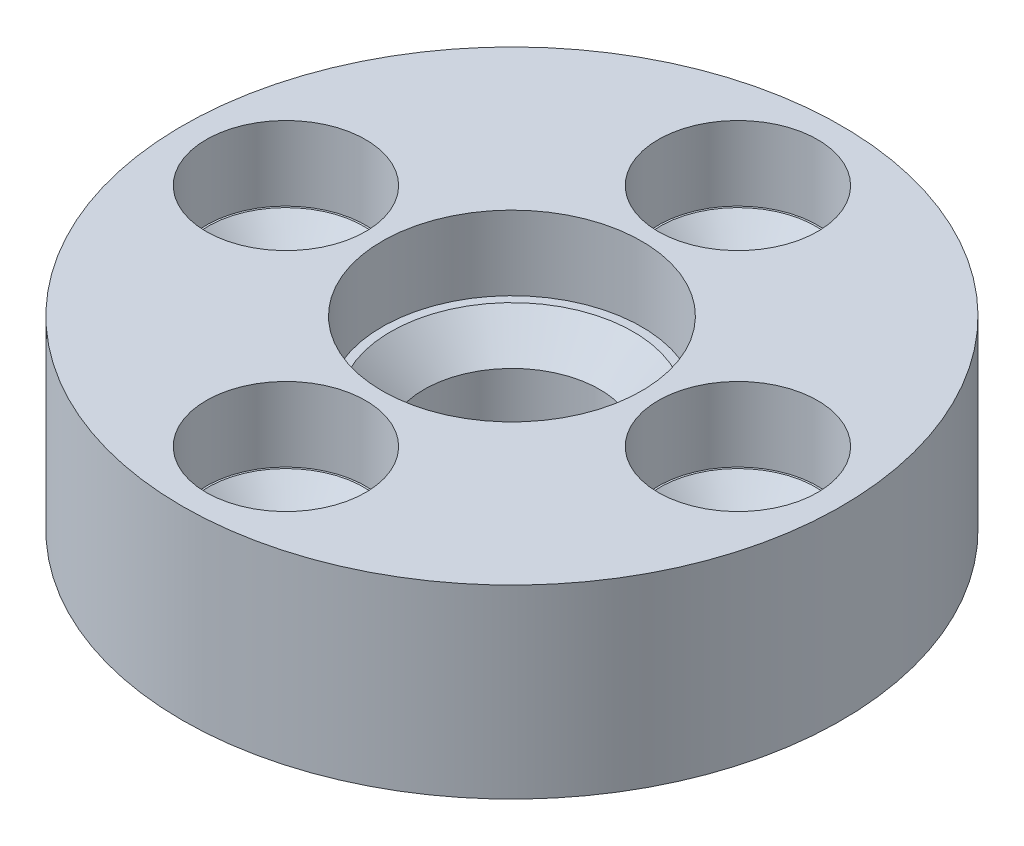
ISO-10303-21;
HEADER;
FILE_DESCRIPTION(('STEP AP214'),'2;1');
FILE_NAME('part.step','',(''),(''),'','','');
FILE_SCHEMA(('AUTOMOTIVE_DESIGN { 1 0 10303 214 1 1 1 1 }'));
ENDSEC;
DATA;
#1=APPLICATION_CONTEXT('core data for automotive mechanical design processes');
#2=APPLICATION_PROTOCOL_DEFINITION('international standard','automotive_design',2000,#1);
#3=PRODUCT_CONTEXT('',#1,'mechanical');
#4=PRODUCT('Part','Part','',(#3));
#5=PRODUCT_RELATED_PRODUCT_CATEGORY('part','',(#4));
#6=PRODUCT_DEFINITION_FORMATION('','',#4);
#7=PRODUCT_DEFINITION_CONTEXT('part definition',#1,'design');
#8=PRODUCT_DEFINITION('design','',#6,#7);
#9=PRODUCT_DEFINITION_SHAPE('','',#8);
#10=(LENGTH_UNIT() NAMED_UNIT(*) SI_UNIT(.MILLI.,.METRE.));
#11=(NAMED_UNIT(*) PLANE_ANGLE_UNIT() SI_UNIT($,.RADIAN.));
#12=(NAMED_UNIT(*) SI_UNIT($,.STERADIAN.) SOLID_ANGLE_UNIT());
#13=UNCERTAINTY_MEASURE_WITH_UNIT(LENGTH_MEASURE(1.E-05),#10,'distance_accuracy_value','');
#14=(GEOMETRIC_REPRESENTATION_CONTEXT(3) GLOBAL_UNCERTAINTY_ASSIGNED_CONTEXT((#13)) GLOBAL_UNIT_ASSIGNED_CONTEXT((#10,
#11,#12)) REPRESENTATION_CONTEXT('',''));
#15=CARTESIAN_POINT('',(0.,0.,0.));
#16=DIRECTION('',(0.,0.,1.));
#17=DIRECTION('',(1.,0.,0.));
#18=AXIS2_PLACEMENT_3D('',#15,#16,#17);
#19=CARTESIAN_POINT('',(6.096,5.,0.));
#20=DIRECTION('',(0.,-1.,0.));
#21=DIRECTION('',(0.,0.,-1.));
#22=AXIS2_PLACEMENT_3D('',#19,#20,#21);
#23=CYLINDRICAL_SURFACE('',#22,1.2);
#24=CARTESIAN_POINT('',(6.096,2.1,0.));
#25=DIRECTION('',(0.,1.,0.));
#26=DIRECTION('',(0.,0.,1.));
#27=AXIS2_PLACEMENT_3D('',#24,#25,#26);
#28=CIRCLE('',#27,1.2);
#29=CARTESIAN_POINT('',(6.096,2.1,1.2));
#30=VERTEX_POINT('',#29);
#31=EDGE_CURVE('E67',#30,#30,#28,.T.);
#32=ORIENTED_EDGE('',*,*,#31,.T.);
#33=EDGE_LOOP('',(#32));
#34=FACE_BOUND('',#33,.T.);
#35=CARTESIAN_POINT('',(6.096,0.,0.));
#36=DIRECTION('',(0.,1.,0.));
#37=DIRECTION('',(0.,0.,1.));
#38=AXIS2_PLACEMENT_3D('',#35,#36,#37);
#39=CIRCLE('',#38,1.2);
#40=CARTESIAN_POINT('',(6.096,0.,1.2));
#41=VERTEX_POINT('',#40);
#42=EDGE_CURVE('E80',#41,#41,#39,.T.);
#43=ORIENTED_EDGE('',*,*,#42,.F.);
#44=EDGE_LOOP('',(#43));
#45=FACE_BOUND('',#44,.T.);
#46=ADVANCED_FACE('F38',(#34,#45),#23,.F.);
#47=CARTESIAN_POINT('',(0.,5.,-6.096));
#48=DIRECTION('',(0.,-1.,0.));
#49=DIRECTION('',(0.,0.,-1.));
#50=AXIS2_PLACEMENT_3D('',#47,#48,#49);
#51=CYLINDRICAL_SURFACE('',#50,1.2);
#52=CARTESIAN_POINT('',(0.,2.1,-6.096));
#53=DIRECTION('',(0.,1.,0.));
#54=DIRECTION('',(0.,0.,1.));
#55=AXIS2_PLACEMENT_3D('',#52,#53,#54);
#56=CIRCLE('',#55,1.2);
#57=CARTESIAN_POINT('',(0.,2.1,-4.896));
#58=VERTEX_POINT('',#57);
#59=EDGE_CURVE('E45',#58,#58,#56,.T.);
#60=ORIENTED_EDGE('',*,*,#59,.T.);
#61=EDGE_LOOP('',(#60));
#62=FACE_BOUND('',#61,.T.);
#63=CARTESIAN_POINT('',(0.,0.,-6.096));
#64=DIRECTION('',(0.,1.,0.));
#65=DIRECTION('',(0.,0.,1.));
#66=AXIS2_PLACEMENT_3D('',#63,#64,#65);
#67=CIRCLE('',#66,1.2);
#68=CARTESIAN_POINT('',(0.,0.,-4.896));
#69=VERTEX_POINT('',#68);
#70=EDGE_CURVE('E83',#69,#69,#67,.T.);
#71=ORIENTED_EDGE('',*,*,#70,.F.);
#72=EDGE_LOOP('',(#71));
#73=FACE_BOUND('',#72,.T.);
#74=ADVANCED_FACE('F171',(#62,#73),#51,.F.);
#75=CARTESIAN_POINT('',(-6.096,5.,0.));
#76=DIRECTION('',(0.,-1.,0.));
#77=DIRECTION('',(0.,0.,-1.));
#78=AXIS2_PLACEMENT_3D('',#75,#76,#77);
#79=CYLINDRICAL_SURFACE('',#78,1.2);
#80=CARTESIAN_POINT('',(-6.096,2.1,0.));
#81=DIRECTION('',(0.,1.,0.));
#82=DIRECTION('',(0.,0.,1.));
#83=AXIS2_PLACEMENT_3D('',#80,#81,#82);
#84=CIRCLE('',#83,1.2);
#85=CARTESIAN_POINT('',(-6.096,2.1,1.2));
#86=VERTEX_POINT('',#85);
#87=EDGE_CURVE('E53',#86,#86,#84,.T.);
#88=ORIENTED_EDGE('',*,*,#87,.T.);
#89=EDGE_LOOP('',(#88));
#90=FACE_BOUND('',#89,.T.);
#91=CARTESIAN_POINT('',(-6.096,0.,0.));
#92=DIRECTION('',(0.,1.,0.));
#93=DIRECTION('',(0.,0.,1.));
#94=AXIS2_PLACEMENT_3D('',#91,#92,#93);
#95=CIRCLE('',#94,1.2);
#96=CARTESIAN_POINT('',(-6.096,0.,1.2));
#97=VERTEX_POINT('',#96);
#98=EDGE_CURVE('E86',#97,#97,#95,.T.);
#99=ORIENTED_EDGE('',*,*,#98,.F.);
#100=EDGE_LOOP('',(#99));
#101=FACE_BOUND('',#100,.T.);
#102=ADVANCED_FACE('F177',(#90,#101),#79,.F.);
#103=CARTESIAN_POINT('',(0.,5.,6.096));
#104=DIRECTION('',(0.,-1.,0.));
#105=DIRECTION('',(0.,0.,-1.));
#106=AXIS2_PLACEMENT_3D('',#103,#104,#105);
#107=CYLINDRICAL_SURFACE('',#106,1.2);
#108=CARTESIAN_POINT('',(0.,2.1,6.096));
#109=DIRECTION('',(0.,1.,0.));
#110=DIRECTION('',(0.,0.,1.));
#111=AXIS2_PLACEMENT_3D('',#108,#109,#110);
#112=CIRCLE('',#111,1.2);
#113=CARTESIAN_POINT('',(0.,2.1,7.296));
#114=VERTEX_POINT('',#113);
#115=EDGE_CURVE('E73',#114,#114,#112,.T.);
#116=ORIENTED_EDGE('',*,*,#115,.T.);
#117=EDGE_LOOP('',(#116));
#118=FACE_BOUND('',#117,.T.);
#119=CARTESIAN_POINT('',(0.,0.,6.096));
#120=DIRECTION('',(0.,1.,0.));
#121=DIRECTION('',(0.,0.,1.));
#122=AXIS2_PLACEMENT_3D('',#119,#120,#121);
#123=CIRCLE('',#122,1.2);
#124=CARTESIAN_POINT('',(0.,0.,7.296));
#125=VERTEX_POINT('',#124);
#126=EDGE_CURVE('E89',#125,#125,#123,.T.);
#127=ORIENTED_EDGE('',*,*,#126,.F.);
#128=EDGE_LOOP('',(#127));
#129=FACE_BOUND('',#128,.T.);
#130=ADVANCED_FACE('F183',(#118,#129),#107,.F.);
#131=CARTESIAN_POINT('',(0.,5.,0.));
#132=DIRECTION('',(0.,-1.,0.));
#133=DIRECTION('',(0.,0.,-1.));
#134=AXIS2_PLACEMENT_3D('',#131,#132,#133);
#135=CYLINDRICAL_SURFACE('',#134,2.37125);
#136=CARTESIAN_POINT('',(0.,2.1,0.));
#137=DIRECTION('',(0.,1.,0.));
#138=DIRECTION('',(0.,0.,1.));
#139=AXIS2_PLACEMENT_3D('',#136,#137,#138);
#140=CIRCLE('',#139,2.37125);
#141=CARTESIAN_POINT('',(0.,2.1,2.37125));
#142=VERTEX_POINT('',#141);
#143=EDGE_CURVE('E61',#142,#142,#140,.T.);
#144=ORIENTED_EDGE('',*,*,#143,.T.);
#145=EDGE_LOOP('',(#144));
#146=FACE_BOUND('',#145,.T.);
#147=CARTESIAN_POINT('',(0.,0.,0.));
#148=DIRECTION('',(0.,1.,0.));
#149=DIRECTION('',(0.,0.,1.));
#150=AXIS2_PLACEMENT_3D('',#147,#148,#149);
#151=CIRCLE('',#150,2.37125);
#152=CARTESIAN_POINT('',(0.,0.,2.37125));
#153=VERTEX_POINT('',#152);
#154=EDGE_CURVE('E92',#153,#153,#151,.T.);
#155=ORIENTED_EDGE('',*,*,#154,.F.);
#156=EDGE_LOOP('',(#155));
#157=FACE_BOUND('',#156,.T.);
#158=ADVANCED_FACE('F155',(#146,#157),#135,.F.);
#159=CARTESIAN_POINT('',(0.,5.,0.));
#160=DIRECTION('',(0.,-1.,0.));
#161=DIRECTION('',(0.,0.,-1.));
#162=AXIS2_PLACEMENT_3D('',#159,#160,#161);
#163=CYLINDRICAL_SURFACE('',#162,8.89);
#164=CARTESIAN_POINT('',(0.,5.,0.));
#165=DIRECTION('',(0.,1.,0.));
#166=DIRECTION('',(0.,0.,1.));
#167=AXIS2_PLACEMENT_3D('',#164,#165,#166);
#168=CIRCLE('',#167,8.89);
#169=CARTESIAN_POINT('',(0.,5.,8.89));
#170=VERTEX_POINT('',#169);
#171=EDGE_CURVE('E76',#170,#170,#168,.T.);
#172=ORIENTED_EDGE('',*,*,#171,.F.);
#173=EDGE_LOOP('',(#172));
#174=FACE_BOUND('',#173,.T.);
#175=CARTESIAN_POINT('',(0.,0.,0.));
#176=DIRECTION('',(0.,1.,0.));
#177=DIRECTION('',(0.,0.,1.));
#178=AXIS2_PLACEMENT_3D('',#175,#176,#177);
#179=CIRCLE('',#178,8.89);
#180=CARTESIAN_POINT('',(0.,0.,8.89));
#181=VERTEX_POINT('',#180);
#182=EDGE_CURVE('E77',#181,#181,#179,.T.);
#183=ORIENTED_EDGE('',*,*,#182,.T.);
#184=EDGE_LOOP('',(#183));
#185=FACE_BOUND('',#184,.T.);
#186=ADVANCED_FACE('F141',(#174,#185),#163,.T.);
#187=CARTESIAN_POINT('',(0.,5.,0.));
#188=DIRECTION('',(0.,1.,0.));
#189=DIRECTION('',(0.,0.,1.));
#190=AXIS2_PLACEMENT_3D('',#187,#188,#189);
#191=PLANE('',#190);
#192=CARTESIAN_POINT('',(0.,5.,-6.096));
#193=DIRECTION('',(0.,1.,0.));
#194=DIRECTION('',(0.,0.,1.));
#195=AXIS2_PLACEMENT_3D('',#192,#193,#194);
#196=CIRCLE('',#195,2.15);
#197=CARTESIAN_POINT('',(0.,5.,-3.946));
#198=VERTEX_POINT('',#197);
#199=EDGE_CURVE('E111',#198,#198,#196,.T.);
#200=ORIENTED_EDGE('',*,*,#199,.F.);
#201=EDGE_LOOP('',(#200));
#202=FACE_BOUND('',#201,.T.);
#203=CARTESIAN_POINT('',(0.,5.,0.));
#204=DIRECTION('',(0.,1.,0.));
#205=DIRECTION('',(0.,0.,1.));
#206=AXIS2_PLACEMENT_3D('',#203,#204,#205);
#207=CIRCLE('',#206,3.5);
#208=CARTESIAN_POINT('',(0.,5.,3.5));
#209=VERTEX_POINT('',#208);
#210=EDGE_CURVE('E112',#209,#209,#207,.T.);
#211=ORIENTED_EDGE('',*,*,#210,.F.);
#212=EDGE_LOOP('',(#211));
#213=FACE_BOUND('',#212,.T.);
#214=CARTESIAN_POINT('',(0.,5.,6.096));
#215=DIRECTION('',(0.,1.,0.));
#216=DIRECTION('',(0.,0.,1.));
#217=AXIS2_PLACEMENT_3D('',#214,#215,#216);
#218=CIRCLE('',#217,2.15);
#219=CARTESIAN_POINT('',(0.,5.,8.246));
#220=VERTEX_POINT('',#219);
#221=EDGE_CURVE('E118',#220,#220,#218,.T.);
#222=ORIENTED_EDGE('',*,*,#221,.F.);
#223=EDGE_LOOP('',(#222));
#224=FACE_BOUND('',#223,.T.);
#225=CARTESIAN_POINT('',(6.096,5.,0.));
#226=DIRECTION('',(0.,1.,0.));
#227=DIRECTION('',(0.,0.,1.));
#228=AXIS2_PLACEMENT_3D('',#225,#226,#227);
#229=CIRCLE('',#228,2.15);
#230=CARTESIAN_POINT('',(6.096,5.,2.15));
#231=VERTEX_POINT('',#230);
#232=EDGE_CURVE('E98',#231,#231,#229,.T.);
#233=ORIENTED_EDGE('',*,*,#232,.F.);
#234=EDGE_LOOP('',(#233));
#235=FACE_BOUND('',#234,.T.);
#236=CARTESIAN_POINT('',(-6.096,5.,0.));
#237=DIRECTION('',(0.,1.,0.));
#238=DIRECTION('',(0.,0.,1.));
#239=AXIS2_PLACEMENT_3D('',#236,#237,#238);
#240=CIRCLE('',#239,2.15);
#241=CARTESIAN_POINT('',(-6.096,5.,2.15));
#242=VERTEX_POINT('',#241);
#243=EDGE_CURVE('E105',#242,#242,#240,.T.);
#244=ORIENTED_EDGE('',*,*,#243,.F.);
#245=EDGE_LOOP('',(#244));
#246=FACE_BOUND('',#245,.T.);
#247=ORIENTED_EDGE('',*,*,#171,.T.);
#248=EDGE_LOOP('',(#247));
#249=FACE_BOUND('',#248,.T.);
#250=ADVANCED_FACE('F137',(#202,#213,#224,#235,#246,#249),#191,.T.);
#251=CARTESIAN_POINT('',(0.,0.,0.));
#252=DIRECTION('',(0.,1.,0.));
#253=DIRECTION('',(0.,0.,1.));
#254=AXIS2_PLACEMENT_3D('',#251,#252,#253);
#255=PLANE('',#254);
#256=ORIENTED_EDGE('',*,*,#154,.T.);
#257=EDGE_LOOP('',(#256));
#258=FACE_BOUND('',#257,.T.);
#259=ORIENTED_EDGE('',*,*,#126,.T.);
#260=EDGE_LOOP('',(#259));
#261=FACE_BOUND('',#260,.T.);
#262=ORIENTED_EDGE('',*,*,#98,.T.);
#263=EDGE_LOOP('',(#262));
#264=FACE_BOUND('',#263,.T.);
#265=ORIENTED_EDGE('',*,*,#70,.T.);
#266=EDGE_LOOP('',(#265));
#267=FACE_BOUND('',#266,.T.);
#268=ORIENTED_EDGE('',*,*,#42,.T.);
#269=EDGE_LOOP('',(#268));
#270=FACE_BOUND('',#269,.T.);
#271=ORIENTED_EDGE('',*,*,#182,.F.);
#272=EDGE_LOOP('',(#271));
#273=FACE_BOUND('',#272,.T.);
#274=ADVANCED_FACE('F140',(#258,#261,#264,#267,#270,#273),#255,.F.);
#275=CARTESIAN_POINT('',(-6.096,3.,0.));
#276=DIRECTION('',(0.,1.,0.));
#277=DIRECTION('',(0.,0.,1.));
#278=AXIS2_PLACEMENT_3D('',#275,#276,#277);
#279=CYLINDRICAL_SURFACE('',#278,2.15);
#280=CARTESIAN_POINT('',(-6.096,3.,0.));
#281=DIRECTION('',(0.,1.,0.));
#282=DIRECTION('',(0.,0.,1.));
#283=AXIS2_PLACEMENT_3D('',#280,#281,#282);
#284=CIRCLE('',#283,2.15);
#285=CARTESIAN_POINT('',(-6.096,3.,2.15));
#286=VERTEX_POINT('',#285);
#287=EDGE_CURVE('E108',#286,#286,#284,.T.);
#288=ORIENTED_EDGE('',*,*,#287,.F.);
#289=EDGE_LOOP('',(#288));
#290=FACE_BOUND('',#289,.T.);
#291=ORIENTED_EDGE('',*,*,#243,.T.);
#292=EDGE_LOOP('',(#291));
#293=FACE_BOUND('',#292,.T.);
#294=ADVANCED_FACE('F160',(#290,#293),#279,.F.);
#295=CARTESIAN_POINT('',(-6.096,3.,0.));
#296=DIRECTION('',(0.,1.,0.));
#297=DIRECTION('',(0.,0.,1.));
#298=AXIS2_PLACEMENT_3D('',#295,#296,#297);
#299=PLANE('',#298);
#300=CARTESIAN_POINT('',(-6.096,3.,0.));
#301=DIRECTION('',(0.,1.,0.));
#302=DIRECTION('',(0.,0.,1.));
#303=AXIS2_PLACEMENT_3D('',#300,#301,#302);
#304=CIRCLE('',#303,2.1);
#305=CARTESIAN_POINT('',(-6.096,3.,2.1));
#306=VERTEX_POINT('',#305);
#307=EDGE_CURVE('E49',#306,#306,#304,.F.);
#308=ORIENTED_EDGE('',*,*,#307,.T.);
#309=EDGE_LOOP('',(#308));
#310=FACE_BOUND('',#309,.T.);
#311=ORIENTED_EDGE('',*,*,#287,.T.);
#312=EDGE_LOOP('',(#311));
#313=FACE_BOUND('',#312,.T.);
#314=ADVANCED_FACE('F166',(#310,#313),#299,.T.);
#315=CARTESIAN_POINT('',(6.096,3.,0.));
#316=DIRECTION('',(0.,1.,0.));
#317=DIRECTION('',(0.,0.,1.));
#318=AXIS2_PLACEMENT_3D('',#315,#316,#317);
#319=CYLINDRICAL_SURFACE('',#318,2.15);
#320=CARTESIAN_POINT('',(6.096,3.,0.));
#321=DIRECTION('',(0.,1.,0.));
#322=DIRECTION('',(0.,0.,1.));
#323=AXIS2_PLACEMENT_3D('',#320,#321,#322);
#324=CIRCLE('',#323,2.15);
#325=CARTESIAN_POINT('',(6.096,3.,2.15));
#326=VERTEX_POINT('',#325);
#327=EDGE_CURVE('E101',#326,#326,#324,.T.);
#328=ORIENTED_EDGE('',*,*,#327,.F.);
#329=EDGE_LOOP('',(#328));
#330=FACE_BOUND('',#329,.T.);
#331=ORIENTED_EDGE('',*,*,#232,.T.);
#332=EDGE_LOOP('',(#331));
#333=FACE_BOUND('',#332,.T.);
#334=ADVANCED_FACE('F223',(#330,#333),#319,.F.);
#335=CARTESIAN_POINT('',(6.096,3.,0.));
#336=DIRECTION('',(0.,1.,0.));
#337=DIRECTION('',(0.,0.,1.));
#338=AXIS2_PLACEMENT_3D('',#335,#336,#337);
#339=PLANE('',#338);
#340=CARTESIAN_POINT('',(6.096,3.,0.));
#341=DIRECTION('',(0.,1.,0.));
#342=DIRECTION('',(0.,0.,1.));
#343=AXIS2_PLACEMENT_3D('',#340,#341,#342);
#344=CIRCLE('',#343,2.1);
#345=CARTESIAN_POINT('',(6.096,3.,2.1));
#346=VERTEX_POINT('',#345);
#347=EDGE_CURVE('E64',#346,#346,#344,.F.);
#348=ORIENTED_EDGE('',*,*,#347,.T.);
#349=EDGE_LOOP('',(#348));
#350=FACE_BOUND('',#349,.T.);
#351=ORIENTED_EDGE('',*,*,#327,.T.);
#352=EDGE_LOOP('',(#351));
#353=FACE_BOUND('',#352,.T.);
#354=ADVANCED_FACE('F230',(#350,#353),#339,.T.);
#355=CARTESIAN_POINT('',(0.,3.,6.096));
#356=DIRECTION('',(0.,1.,0.));
#357=DIRECTION('',(0.,0.,1.));
#358=AXIS2_PLACEMENT_3D('',#355,#356,#357);
#359=CYLINDRICAL_SURFACE('',#358,2.15);
#360=CARTESIAN_POINT('',(0.,3.,6.096));
#361=DIRECTION('',(0.,1.,0.));
#362=DIRECTION('',(0.,0.,1.));
#363=AXIS2_PLACEMENT_3D('',#360,#361,#362);
#364=CIRCLE('',#363,2.15);
#365=CARTESIAN_POINT('',(0.,3.,8.246));
#366=VERTEX_POINT('',#365);
#367=EDGE_CURVE('E102',#366,#366,#364,.T.);
#368=ORIENTED_EDGE('',*,*,#367,.F.);
#369=EDGE_LOOP('',(#368));
#370=FACE_BOUND('',#369,.T.);
#371=ORIENTED_EDGE('',*,*,#221,.T.);
#372=EDGE_LOOP('',(#371));
#373=FACE_BOUND('',#372,.T.);
#374=ADVANCED_FACE('F238',(#370,#373),#359,.F.);
#375=CARTESIAN_POINT('',(0.,3.,6.096));
#376=DIRECTION('',(0.,1.,0.));
#377=DIRECTION('',(0.,0.,1.));
#378=AXIS2_PLACEMENT_3D('',#375,#376,#377);
#379=PLANE('',#378);
#380=CARTESIAN_POINT('',(0.,3.,6.096));
#381=DIRECTION('',(0.,1.,0.));
#382=DIRECTION('',(0.,0.,1.));
#383=AXIS2_PLACEMENT_3D('',#380,#381,#382);
#384=CIRCLE('',#383,2.1);
#385=CARTESIAN_POINT('',(0.,3.,8.196));
#386=VERTEX_POINT('',#385);
#387=EDGE_CURVE('E70',#386,#386,#384,.F.);
#388=ORIENTED_EDGE('',*,*,#387,.T.);
#389=EDGE_LOOP('',(#388));
#390=FACE_BOUND('',#389,.T.);
#391=ORIENTED_EDGE('',*,*,#367,.T.);
#392=EDGE_LOOP('',(#391));
#393=FACE_BOUND('',#392,.T.);
#394=ADVANCED_FACE('F243',(#390,#393),#379,.T.);
#395=CARTESIAN_POINT('',(0.,3.,0.));
#396=DIRECTION('',(0.,1.,0.));
#397=DIRECTION('',(0.,0.,1.));
#398=AXIS2_PLACEMENT_3D('',#395,#396,#397);
#399=CYLINDRICAL_SURFACE('',#398,3.5);
#400=CARTESIAN_POINT('',(0.,3.,0.));
#401=DIRECTION('',(0.,1.,0.));
#402=DIRECTION('',(0.,0.,1.));
#403=AXIS2_PLACEMENT_3D('',#400,#401,#402);
#404=CIRCLE('',#403,3.5);
#405=CARTESIAN_POINT('',(0.,3.,3.5));
#406=VERTEX_POINT('',#405);
#407=EDGE_CURVE('E115',#406,#406,#404,.T.);
#408=ORIENTED_EDGE('',*,*,#407,.F.);
#409=EDGE_LOOP('',(#408));
#410=FACE_BOUND('',#409,.T.);
#411=ORIENTED_EDGE('',*,*,#210,.T.);
#412=EDGE_LOOP('',(#411));
#413=FACE_BOUND('',#412,.T.);
#414=ADVANCED_FACE('F234',(#410,#413),#399,.F.);
#415=CARTESIAN_POINT('',(0.,3.,0.));
#416=DIRECTION('',(0.,1.,0.));
#417=DIRECTION('',(0.,0.,1.));
#418=AXIS2_PLACEMENT_3D('',#415,#416,#417);
#419=PLANE('',#418);
#420=CARTESIAN_POINT('',(0.,3.,0.));
#421=DIRECTION('',(0.,1.,0.));
#422=DIRECTION('',(0.,0.,1.));
#423=AXIS2_PLACEMENT_3D('',#420,#421,#422);
#424=CIRCLE('',#423,3.27125);
#425=CARTESIAN_POINT('',(0.,3.,3.27125));
#426=VERTEX_POINT('',#425);
#427=EDGE_CURVE('E58',#426,#426,#424,.F.);
#428=ORIENTED_EDGE('',*,*,#427,.T.);
#429=EDGE_LOOP('',(#428));
#430=FACE_BOUND('',#429,.T.);
#431=ORIENTED_EDGE('',*,*,#407,.T.);
#432=EDGE_LOOP('',(#431));
#433=FACE_BOUND('',#432,.T.);
#434=ADVANCED_FACE('F133',(#430,#433),#419,.T.);
#435=CARTESIAN_POINT('',(0.,3.,-6.096));
#436=DIRECTION('',(0.,1.,0.));
#437=DIRECTION('',(0.,0.,1.));
#438=AXIS2_PLACEMENT_3D('',#435,#436,#437);
#439=CYLINDRICAL_SURFACE('',#438,2.15);
#440=CARTESIAN_POINT('',(0.,3.,-6.096));
#441=DIRECTION('',(0.,1.,0.));
#442=DIRECTION('',(0.,0.,1.));
#443=AXIS2_PLACEMENT_3D('',#440,#441,#442);
#444=CIRCLE('',#443,2.15);
#445=CARTESIAN_POINT('',(0.,3.,-3.946));
#446=VERTEX_POINT('',#445);
#447=EDGE_CURVE('E95',#446,#446,#444,.T.);
#448=ORIENTED_EDGE('',*,*,#447,.F.);
#449=EDGE_LOOP('',(#448));
#450=FACE_BOUND('',#449,.T.);
#451=ORIENTED_EDGE('',*,*,#199,.T.);
#452=EDGE_LOOP('',(#451));
#453=FACE_BOUND('',#452,.T.);
#454=ADVANCED_FACE('F130',(#450,#453),#439,.F.);
#455=CARTESIAN_POINT('',(0.,3.,-6.096));
#456=DIRECTION('',(0.,1.,0.));
#457=DIRECTION('',(0.,0.,1.));
#458=AXIS2_PLACEMENT_3D('',#455,#456,#457);
#459=PLANE('',#458);
#460=CARTESIAN_POINT('',(0.,3.,-6.096));
#461=DIRECTION('',(0.,1.,0.));
#462=DIRECTION('',(0.,0.,1.));
#463=AXIS2_PLACEMENT_3D('',#460,#461,#462);
#464=CIRCLE('',#463,2.1);
#465=CARTESIAN_POINT('',(0.,3.,-3.996));
#466=VERTEX_POINT('',#465);
#467=EDGE_CURVE('E10',#466,#466,#464,.F.);
#468=ORIENTED_EDGE('',*,*,#467,.T.);
#469=EDGE_LOOP('',(#468));
#470=FACE_BOUND('',#469,.T.);
#471=ORIENTED_EDGE('',*,*,#447,.T.);
#472=EDGE_LOOP('',(#471));
#473=FACE_BOUND('',#472,.T.);
#474=ADVANCED_FACE('F128',(#470,#473),#459,.T.);
#475=CARTESIAN_POINT('',(0.,2.1,6.096));
#476=DIRECTION('',(0.,1.,0.));
#477=DIRECTION('',(0.,0.,1.));
#478=AXIS2_PLACEMENT_3D('',#475,#476,#477);
#479=CONICAL_SURFACE('',#478,1.2,0.78539816339745);
#480=ORIENTED_EDGE('',*,*,#387,.F.);
#481=EDGE_LOOP('',(#480));
#482=FACE_BOUND('',#481,.T.);
#483=ORIENTED_EDGE('',*,*,#115,.F.);
#484=EDGE_LOOP('',(#483));
#485=FACE_BOUND('',#484,.T.);
#486=ADVANCED_FACE('F191',(#482,#485),#479,.F.);
#487=CARTESIAN_POINT('',(6.096,2.1,0.));
#488=DIRECTION('',(0.,1.,0.));
#489=DIRECTION('',(0.,0.,1.));
#490=AXIS2_PLACEMENT_3D('',#487,#488,#489);
#491=CONICAL_SURFACE('',#490,1.2,0.78539816339745);
#492=CARTESIAN_POINT('',(6.096,3.,2.1));
#493=CARTESIAN_POINT('',(6.096,2.990625,2.090625));
#494=CARTESIAN_POINT('',(6.096,2.98125,2.08125));
#495=CARTESIAN_POINT('',(6.096,2.9625,2.0625));
#496=CARTESIAN_POINT('',(6.096,2.953125,2.053125));
#497=CARTESIAN_POINT('',(6.096,2.934375,2.034375));
#498=CARTESIAN_POINT('',(6.096,2.925,2.025));
#499=CARTESIAN_POINT('',(6.096,2.90625,2.00625));
#500=CARTESIAN_POINT('',(6.096,2.896875,1.996875));
#501=CARTESIAN_POINT('',(6.096,2.878125,1.978125));
#502=CARTESIAN_POINT('',(6.096,2.86875,1.96875));
#503=CARTESIAN_POINT('',(6.096,2.85,1.95));
#504=CARTESIAN_POINT('',(6.096,2.840625,1.940625));
#505=CARTESIAN_POINT('',(6.096,2.821875,1.921875));
#506=CARTESIAN_POINT('',(6.096,2.8125,1.9125));
#507=CARTESIAN_POINT('',(6.096,2.79375,1.89375));
#508=CARTESIAN_POINT('',(6.096,2.784375,1.884375));
#509=CARTESIAN_POINT('',(6.096,2.765625,1.865625));
#510=CARTESIAN_POINT('',(6.096,2.75625,1.85625));
#511=CARTESIAN_POINT('',(6.096,2.7375,1.8375));
#512=CARTESIAN_POINT('',(6.096,2.728125,1.828125));
#513=CARTESIAN_POINT('',(6.096,2.709375,1.809375));
#514=CARTESIAN_POINT('',(6.096,2.7,1.8));
#515=CARTESIAN_POINT('',(6.096,2.68125,1.78125));
#516=CARTESIAN_POINT('',(6.096,2.671875,1.771875));
#517=CARTESIAN_POINT('',(6.096,2.653125,1.753125));
#518=CARTESIAN_POINT('',(6.096,2.64375,1.74375));
#519=CARTESIAN_POINT('',(6.096,2.625,1.725));
#520=CARTESIAN_POINT('',(6.096,2.615625,1.715625));
#521=CARTESIAN_POINT('',(6.096,2.596875,1.696875));
#522=CARTESIAN_POINT('',(6.096,2.5875,1.6875));
#523=CARTESIAN_POINT('',(6.096,2.56875,1.66875));
#524=CARTESIAN_POINT('',(6.096,2.559375,1.659375));
#525=CARTESIAN_POINT('',(6.096,2.540625,1.640625));
#526=CARTESIAN_POINT('',(6.096,2.53125,1.63125));
#527=CARTESIAN_POINT('',(6.096,2.5125,1.6125));
#528=CARTESIAN_POINT('',(6.096,2.503125,1.603125));
#529=CARTESIAN_POINT('',(6.096,2.484375,1.584375));
#530=CARTESIAN_POINT('',(6.096,2.475,1.575));
#531=CARTESIAN_POINT('',(6.096,2.45625,1.55625));
#532=CARTESIAN_POINT('',(6.096,2.446875,1.546875));
#533=CARTESIAN_POINT('',(6.096,2.428125,1.528125));
#534=CARTESIAN_POINT('',(6.096,2.41875,1.51875));
#535=CARTESIAN_POINT('',(6.096,2.4,1.5));
#536=CARTESIAN_POINT('',(6.096,2.390625,1.490625));
#537=CARTESIAN_POINT('',(6.096,2.371875,1.471875));
#538=CARTESIAN_POINT('',(6.096,2.3625,1.4625));
#539=CARTESIAN_POINT('',(6.096,2.34375,1.44375));
#540=CARTESIAN_POINT('',(6.096,2.334375,1.434375));
#541=CARTESIAN_POINT('',(6.096,2.315625,1.415625));
#542=CARTESIAN_POINT('',(6.096,2.30625,1.40625));
#543=CARTESIAN_POINT('',(6.096,2.2875,1.3875));
#544=CARTESIAN_POINT('',(6.096,2.278125,1.378125));
#545=CARTESIAN_POINT('',(6.096,2.259375,1.359375));
#546=CARTESIAN_POINT('',(6.096,2.25,1.35));
#547=CARTESIAN_POINT('',(6.096,2.23125,1.33125));
#548=CARTESIAN_POINT('',(6.096,2.221875,1.321875));
#549=CARTESIAN_POINT('',(6.096,2.203125,1.303125));
#550=CARTESIAN_POINT('',(6.096,2.19375,1.29375));
#551=CARTESIAN_POINT('',(6.096,2.175,1.275));
#552=CARTESIAN_POINT('',(6.096,2.165625,1.265625));
#553=CARTESIAN_POINT('',(6.096,2.146875,1.246875));
#554=CARTESIAN_POINT('',(6.096,2.1375,1.2375));
#555=CARTESIAN_POINT('',(6.096,2.11875,1.21875));
#556=CARTESIAN_POINT('',(6.096,2.109375,1.209375));
#557=CARTESIAN_POINT('',(6.096,2.1,1.2));
#558=B_SPLINE_CURVE_WITH_KNOTS('',3,(#492,#493,#494,#495,#496,#497,#498,#499,#500,#501,#502,
#503,#504,#505,#506,#507,#508,#509,#510,#511,#512,#513,#514,#515,#516,#517,#518,#519,#520,#521,
#522,#523,#524,#525,#526,#527,#528,#529,#530,#531,#532,#533,#534,#535,#536,#537,#538,#539,#540,
#541,#542,#543,#544,#545,#546,#547,#548,#549,#550,#551,#552,#553,#554,#555,#556,#557),
.UNSPECIFIED.,.F.,.F.,(4,2,2,2,2,2,2,2,2,2,2,2,2,2,2,2,2,2,2,2,2,2,2,2,2,2,2,2,2,2,2,2,4),(0.,
0.0397747564417432,0.0795495128834864,0.11932426932523,0.159099025766973,0.198873782208716,
0.23864853865046,0.278423295092203,0.318198051533946,0.357972807975689,0.397747564417433,
0.437522320859176,0.477297077300919,0.517071833742663,0.556846590184406,0.596621346626149,
0.636396103067893,0.676170859509636,0.715945615951379,0.755720372393122,0.795495128834866,
0.835269885276609,0.875044641718352,0.914819398160096,0.954594154601839,0.994368911043582,
1.03414366748533,1.07391842392707,1.11369318036881,1.15346793681056,1.1932426932523,
1.23301744969404,1.27279220613579),.UNSPECIFIED.);
#559=EDGE_CURVE('BSEAM194',#346,#30,#558,.T.);
#560=ORIENTED_EDGE('',*,*,#347,.F.);
#561=ORIENTED_EDGE('',*,*,#31,.F.);
#562=ORIENTED_EDGE('',*,*,#559,.T.);
#563=ORIENTED_EDGE('',*,*,#559,.F.);
#564=EDGE_LOOP('',(#560,#562,#561,#563));
#565=FACE_BOUND('',#564,.T.);
#566=ADVANCED_FACE('F194',(#565),#491,.F.);
#567=CARTESIAN_POINT('',(0.,2.1,0.));
#568=DIRECTION('',(0.,1.,0.));
#569=DIRECTION('',(0.,0.,1.));
#570=AXIS2_PLACEMENT_3D('',#567,#568,#569);
#571=CONICAL_SURFACE('',#570,2.37125,0.78539816339745);
#572=ORIENTED_EDGE('',*,*,#427,.F.);
#573=EDGE_LOOP('',(#572));
#574=FACE_BOUND('',#573,.T.);
#575=ORIENTED_EDGE('',*,*,#143,.F.);
#576=EDGE_LOOP('',(#575));
#577=FACE_BOUND('',#576,.T.);
#578=ADVANCED_FACE('F198',(#574,#577),#571,.F.);
#579=CARTESIAN_POINT('',(-6.096,2.1,0.));
#580=DIRECTION('',(0.,1.,0.));
#581=DIRECTION('',(0.,0.,1.));
#582=AXIS2_PLACEMENT_3D('',#579,#580,#581);
#583=CONICAL_SURFACE('',#582,1.2,0.78539816339745);
#584=CARTESIAN_POINT('',(-6.096,3.,2.1));
#585=CARTESIAN_POINT('',(-6.096,2.990625,2.090625));
#586=CARTESIAN_POINT('',(-6.096,2.98125,2.08125));
#587=CARTESIAN_POINT('',(-6.096,2.9625,2.0625));
#588=CARTESIAN_POINT('',(-6.096,2.953125,2.053125));
#589=CARTESIAN_POINT('',(-6.096,2.934375,2.034375));
#590=CARTESIAN_POINT('',(-6.096,2.925,2.025));
#591=CARTESIAN_POINT('',(-6.096,2.90625,2.00625));
#592=CARTESIAN_POINT('',(-6.096,2.896875,1.996875));
#593=CARTESIAN_POINT('',(-6.096,2.878125,1.978125));
#594=CARTESIAN_POINT('',(-6.096,2.86875,1.96875));
#595=CARTESIAN_POINT('',(-6.096,2.85,1.95));
#596=CARTESIAN_POINT('',(-6.096,2.840625,1.940625));
#597=CARTESIAN_POINT('',(-6.096,2.821875,1.921875));
#598=CARTESIAN_POINT('',(-6.096,2.8125,1.9125));
#599=CARTESIAN_POINT('',(-6.096,2.79375,1.89375));
#600=CARTESIAN_POINT('',(-6.096,2.784375,1.884375));
#601=CARTESIAN_POINT('',(-6.096,2.765625,1.865625));
#602=CARTESIAN_POINT('',(-6.096,2.75625,1.85625));
#603=CARTESIAN_POINT('',(-6.096,2.7375,1.8375));
#604=CARTESIAN_POINT('',(-6.096,2.728125,1.828125));
#605=CARTESIAN_POINT('',(-6.096,2.709375,1.809375));
#606=CARTESIAN_POINT('',(-6.096,2.7,1.8));
#607=CARTESIAN_POINT('',(-6.096,2.68125,1.78125));
#608=CARTESIAN_POINT('',(-6.096,2.671875,1.771875));
#609=CARTESIAN_POINT('',(-6.096,2.653125,1.753125));
#610=CARTESIAN_POINT('',(-6.096,2.64375,1.74375));
#611=CARTESIAN_POINT('',(-6.096,2.625,1.725));
#612=CARTESIAN_POINT('',(-6.096,2.615625,1.715625));
#613=CARTESIAN_POINT('',(-6.096,2.596875,1.696875));
#614=CARTESIAN_POINT('',(-6.096,2.5875,1.6875));
#615=CARTESIAN_POINT('',(-6.096,2.56875,1.66875));
#616=CARTESIAN_POINT('',(-6.096,2.559375,1.659375));
#617=CARTESIAN_POINT('',(-6.096,2.540625,1.640625));
#618=CARTESIAN_POINT('',(-6.096,2.53125,1.63125));
#619=CARTESIAN_POINT('',(-6.096,2.5125,1.6125));
#620=CARTESIAN_POINT('',(-6.096,2.503125,1.603125));
#621=CARTESIAN_POINT('',(-6.096,2.484375,1.584375));
#622=CARTESIAN_POINT('',(-6.096,2.475,1.575));
#623=CARTESIAN_POINT('',(-6.096,2.45625,1.55625));
#624=CARTESIAN_POINT('',(-6.096,2.446875,1.546875));
#625=CARTESIAN_POINT('',(-6.096,2.428125,1.528125));
#626=CARTESIAN_POINT('',(-6.096,2.41875,1.51875));
#627=CARTESIAN_POINT('',(-6.096,2.4,1.5));
#628=CARTESIAN_POINT('',(-6.096,2.390625,1.490625));
#629=CARTESIAN_POINT('',(-6.096,2.371875,1.471875));
#630=CARTESIAN_POINT('',(-6.096,2.3625,1.4625));
#631=CARTESIAN_POINT('',(-6.096,2.34375,1.44375));
#632=CARTESIAN_POINT('',(-6.096,2.334375,1.434375));
#633=CARTESIAN_POINT('',(-6.096,2.315625,1.415625));
#634=CARTESIAN_POINT('',(-6.096,2.30625,1.40625));
#635=CARTESIAN_POINT('',(-6.096,2.2875,1.3875));
#636=CARTESIAN_POINT('',(-6.096,2.278125,1.378125));
#637=CARTESIAN_POINT('',(-6.096,2.259375,1.359375));
#638=CARTESIAN_POINT('',(-6.096,2.25,1.35));
#639=CARTESIAN_POINT('',(-6.096,2.23125,1.33125));
#640=CARTESIAN_POINT('',(-6.096,2.221875,1.321875));
#641=CARTESIAN_POINT('',(-6.096,2.203125,1.303125));
#642=CARTESIAN_POINT('',(-6.096,2.19375,1.29375));
#643=CARTESIAN_POINT('',(-6.096,2.175,1.275));
#644=CARTESIAN_POINT('',(-6.096,2.165625,1.265625));
#645=CARTESIAN_POINT('',(-6.096,2.146875,1.246875));
#646=CARTESIAN_POINT('',(-6.096,2.1375,1.2375));
#647=CARTESIAN_POINT('',(-6.096,2.11875,1.21875));
#648=CARTESIAN_POINT('',(-6.096,2.109375,1.209375));
#649=CARTESIAN_POINT('',(-6.096,2.1,1.2));
#650=B_SPLINE_CURVE_WITH_KNOTS('',3,(#584,#585,#586,#587,#588,#589,#590,#591,#592,#593,#594,
#595,#596,#597,#598,#599,#600,#601,#602,#603,#604,#605,#606,#607,#608,#609,#610,#611,#612,#613,
#614,#615,#616,#617,#618,#619,#620,#621,#622,#623,#624,#625,#626,#627,#628,#629,#630,#631,#632,
#633,#634,#635,#636,#637,#638,#639,#640,#641,#642,#643,#644,#645,#646,#647,#648,#649),
.UNSPECIFIED.,.F.,.F.,(4,2,2,2,2,2,2,2,2,2,2,2,2,2,2,2,2,2,2,2,2,2,2,2,2,2,2,2,2,2,2,2,4),(0.,
0.0397747564417432,0.0795495128834864,0.11932426932523,0.159099025766973,0.198873782208716,
0.23864853865046,0.278423295092203,0.318198051533946,0.357972807975689,0.397747564417433,
0.437522320859176,0.477297077300919,0.517071833742663,0.556846590184406,0.596621346626149,
0.636396103067893,0.676170859509636,0.715945615951379,0.755720372393122,0.795495128834866,
0.835269885276609,0.875044641718352,0.914819398160096,0.954594154601839,0.994368911043582,
1.03414366748533,1.07391842392707,1.11369318036881,1.15346793681056,1.1932426932523,
1.23301744969404,1.27279220613579),.UNSPECIFIED.);
#651=EDGE_CURVE('BSEAM201',#306,#86,#650,.T.);
#652=ORIENTED_EDGE('',*,*,#307,.F.);
#653=ORIENTED_EDGE('',*,*,#87,.F.);
#654=ORIENTED_EDGE('',*,*,#651,.T.);
#655=ORIENTED_EDGE('',*,*,#651,.F.);
#656=EDGE_LOOP('',(#652,#654,#653,#655));
#657=FACE_BOUND('',#656,.T.);
#658=ADVANCED_FACE('F201',(#657),#583,.F.);
#659=CARTESIAN_POINT('',(0.,2.1,-6.096));
#660=DIRECTION('',(0.,1.,0.));
#661=DIRECTION('',(0.,0.,1.));
#662=AXIS2_PLACEMENT_3D('',#659,#660,#661);
#663=CONICAL_SURFACE('',#662,1.2,0.78539816339745);
#664=ORIENTED_EDGE('',*,*,#467,.F.);
#665=EDGE_LOOP('',(#664));
#666=FACE_BOUND('',#665,.T.);
#667=ORIENTED_EDGE('',*,*,#59,.F.);
#668=EDGE_LOOP('',(#667));
#669=FACE_BOUND('',#668,.T.);
#670=ADVANCED_FACE('F40',(#666,#669),#663,.F.);
#671=CLOSED_SHELL('',(#46,#74,#102,#130,#158,#186,#250,#274,#294,#314,#334,#354,#374,#394,#414,
#434,#454,#474,#486,#566,#578,#658,#670));
#672=MANIFOLD_SOLID_BREP('B2',#671);
#673=ADVANCED_BREP_SHAPE_REPRESENTATION('',(#18,#672),#14);
#674=SHAPE_DEFINITION_REPRESENTATION(#9,#673);
ENDSEC;
END-ISO-10303-21;
